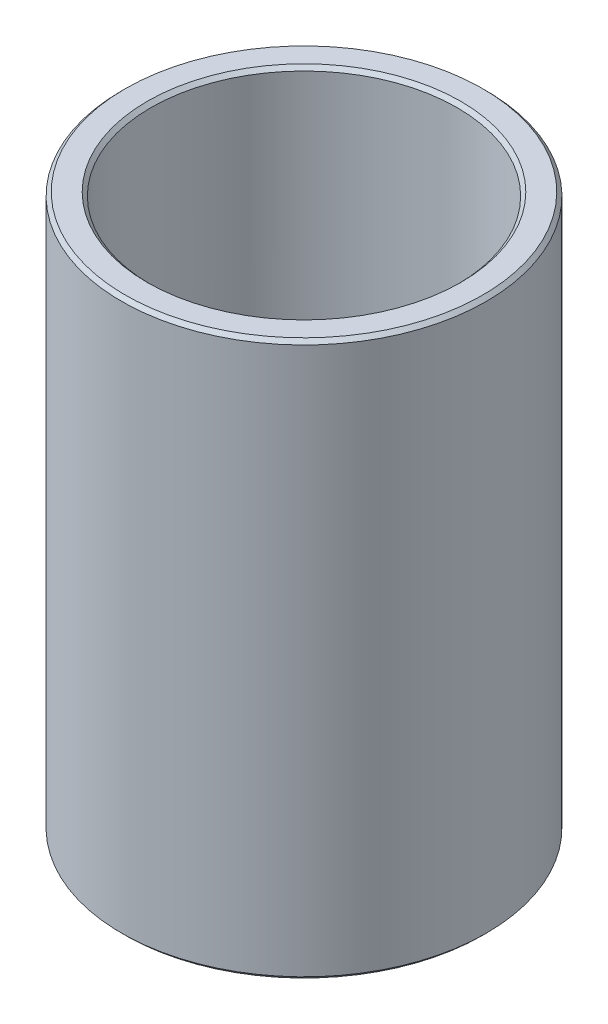
ISO-10303-21;
HEADER;
FILE_DESCRIPTION(('STEP AP214'),'2;1');
FILE_NAME('part.step','',(''),(''),'','','');
FILE_SCHEMA(('AUTOMOTIVE_DESIGN { 1 0 10303 214 1 1 1 1 }'));
ENDSEC;
DATA;
#1=APPLICATION_CONTEXT('core data for automotive mechanical design processes');
#2=APPLICATION_PROTOCOL_DEFINITION('international standard','automotive_design',2000,#1);
#3=PRODUCT_CONTEXT('',#1,'mechanical');
#4=PRODUCT('Part','Part','',(#3));
#5=PRODUCT_RELATED_PRODUCT_CATEGORY('part','',(#4));
#6=PRODUCT_DEFINITION_FORMATION('','',#4);
#7=PRODUCT_DEFINITION_CONTEXT('part definition',#1,'design');
#8=PRODUCT_DEFINITION('design','',#6,#7);
#9=PRODUCT_DEFINITION_SHAPE('','',#8);
#10=(LENGTH_UNIT() NAMED_UNIT(*) SI_UNIT(.MILLI.,.METRE.));
#11=(NAMED_UNIT(*) PLANE_ANGLE_UNIT() SI_UNIT($,.RADIAN.));
#12=(NAMED_UNIT(*) SI_UNIT($,.STERADIAN.) SOLID_ANGLE_UNIT());
#13=UNCERTAINTY_MEASURE_WITH_UNIT(LENGTH_MEASURE(1.E-05),#10,'distance_accuracy_value','');
#14=(GEOMETRIC_REPRESENTATION_CONTEXT(3) GLOBAL_UNCERTAINTY_ASSIGNED_CONTEXT((#13)) GLOBAL_UNIT_ASSIGNED_CONTEXT((#10,
#11,#12)) REPRESENTATION_CONTEXT('',''));
#15=CARTESIAN_POINT('',(0.,0.,0.));
#16=DIRECTION('',(0.,0.,1.));
#17=DIRECTION('',(1.,0.,0.));
#18=AXIS2_PLACEMENT_3D('',#15,#16,#17);
#19=CARTESIAN_POINT('',(12.5,0.,0.));
#20=DIRECTION('',(0.,-1.,0.));
#21=DIRECTION('',(1.,0.,0.));
#22=AXIS2_PLACEMENT_3D('',#19,#20,#21);
#23=PLANE('',#22);
#24=CARTESIAN_POINT('',(0.,0.,0.));
#25=DIRECTION('',(0.,-1.,0.));
#26=DIRECTION('',(1.,0.,0.));
#27=AXIS2_PLACEMENT_3D('',#24,#25,#26);
#28=CIRCLE('',#27,2.25000000000011);
#29=CARTESIAN_POINT('',(2.25000000000011,0.,0.));
#30=VERTEX_POINT('',#29);
#31=EDGE_CURVE('E10',#30,#30,#28,.F.);
#32=ORIENTED_EDGE('',*,*,#31,.T.);
#33=EDGE_LOOP('',(#32));
#34=FACE_BOUND('',#33,.T.);
#35=CARTESIAN_POINT('',(0.,0.,0.));
#36=DIRECTION('',(0.,-1.,0.));
#37=DIRECTION('',(1.,0.,0.));
#38=AXIS2_PLACEMENT_3D('',#35,#36,#37);
#39=CIRCLE('',#38,12.2499999999999);
#40=CARTESIAN_POINT('',(12.2499999999999,0.,0.));
#41=VERTEX_POINT('',#40);
#42=EDGE_CURVE('E42',#41,#41,#39,.T.);
#43=ORIENTED_EDGE('',*,*,#42,.T.);
#44=EDGE_LOOP('',(#43));
#45=FACE_BOUND('',#44,.T.);
#46=ADVANCED_FACE('F34',(#34,#45),#23,.T.);
#47=CARTESIAN_POINT('',(2.0140746375547E-12,-587.151147980489,0.));
#48=DIRECTION('',(0.,-1.,0.));
#49=DIRECTION('',(1.,0.,0.));
#50=AXIS2_PLACEMENT_3D('',#47,#48,#49);
#51=CYLINDRICAL_SURFACE('',#50,2.);
#52=CARTESIAN_POINT('',(0.,0.250000000000083,0.));
#53=DIRECTION('',(0.,-1.,0.));
#54=DIRECTION('',(1.,0.,0.));
#55=AXIS2_PLACEMENT_3D('',#52,#53,#54);
#56=CIRCLE('',#55,2.);
#57=CARTESIAN_POINT('',(2.,0.25000000000009,0.));
#58=VERTEX_POINT('',#57);
#59=EDGE_CURVE('E46',#58,#58,#56,.T.);
#60=ORIENTED_EDGE('',*,*,#59,.T.);
#61=EDGE_LOOP('',(#60));
#62=FACE_BOUND('',#61,.T.);
#63=CARTESIAN_POINT('',(0.,1.,0.));
#64=DIRECTION('',(0.,-1.,0.));
#65=DIRECTION('',(1.,0.,0.));
#66=AXIS2_PLACEMENT_3D('',#63,#64,#65);
#67=CIRCLE('',#66,2.);
#68=CARTESIAN_POINT('',(2.,1.00000000000001,0.));
#69=VERTEX_POINT('',#68);
#70=EDGE_CURVE('E67',#69,#69,#67,.T.);
#71=ORIENTED_EDGE('',*,*,#70,.F.);
#72=EDGE_LOOP('',(#71));
#73=FACE_BOUND('',#72,.T.);
#74=ADVANCED_FACE('F91',(#62,#73),#51,.F.);
#75=CARTESIAN_POINT('',(0.,4.,0.));
#76=DIRECTION('',(0.,1.,0.));
#77=DIRECTION('',(-1.,0.,0.));
#78=AXIS2_PLACEMENT_3D('',#75,#76,#77);
#79=CONICAL_SURFACE('',#78,5.00000000000001,0.78539816339745);
#80=ORIENTED_EDGE('',*,*,#70,.T.);
#81=EDGE_LOOP('',(#80));
#82=FACE_BOUND('',#81,.T.);
#83=CARTESIAN_POINT('',(0.,4.,0.));
#84=DIRECTION('',(0.,-1.,0.));
#85=DIRECTION('',(1.,0.,0.));
#86=AXIS2_PLACEMENT_3D('',#83,#84,#85);
#87=CIRCLE('',#86,5.00000000000001);
#88=CARTESIAN_POINT('',(5.,4.00000000000002,0.));
#89=VERTEX_POINT('',#88);
#90=EDGE_CURVE('E70',#89,#89,#87,.T.);
#91=ORIENTED_EDGE('',*,*,#90,.F.);
#92=EDGE_LOOP('',(#91));
#93=FACE_BOUND('',#92,.T.);
#94=ADVANCED_FACE('F81',(#82,#93),#79,.F.);
#95=CARTESIAN_POINT('',(5.,3.99999999999999,0.));
#96=DIRECTION('',(0.,1.,0.));
#97=DIRECTION('',(-1.,0.,0.));
#98=AXIS2_PLACEMENT_3D('',#95,#96,#97);
#99=PLANE('',#98);
#100=ORIENTED_EDGE('',*,*,#90,.T.);
#101=EDGE_LOOP('',(#100));
#102=FACE_BOUND('',#101,.T.);
#103=CARTESIAN_POINT('',(0.,4.,0.));
#104=DIRECTION('',(0.,-1.,0.));
#105=DIRECTION('',(1.,0.,0.));
#106=AXIS2_PLACEMENT_3D('',#103,#104,#105);
#107=CIRCLE('',#106,10.5);
#108=CARTESIAN_POINT('',(10.5,4.00000000000004,0.));
#109=VERTEX_POINT('',#108);
#110=EDGE_CURVE('E73',#109,#109,#107,.T.);
#111=ORIENTED_EDGE('',*,*,#110,.F.);
#112=EDGE_LOOP('',(#111));
#113=FACE_BOUND('',#112,.T.);
#114=ADVANCED_FACE('F79',(#102,#113),#99,.T.);
#115=CARTESIAN_POINT('',(2.0140746375547E-12,-587.151147980489,0.));
#116=DIRECTION('',(0.,-1.,0.));
#117=DIRECTION('',(1.,0.,0.));
#118=AXIS2_PLACEMENT_3D('',#115,#116,#117);
#119=CYLINDRICAL_SURFACE('',#118,10.5000000000001);
#120=CARTESIAN_POINT('',(-1.29491899707939E-13,37.7500000000001,0.));
#121=DIRECTION('',(0.,1.,0.));
#122=DIRECTION('',(-1.,0.,0.));
#123=AXIS2_PLACEMENT_3D('',#120,#121,#122);
#124=CIRCLE('',#123,10.5000000000001);
#125=CARTESIAN_POINT('',(-10.5000000000002,37.75,0.));
#126=VERTEX_POINT('',#125);
#127=EDGE_CURVE('E50',#126,#126,#124,.T.);
#128=ORIENTED_EDGE('',*,*,#127,.T.);
#129=EDGE_LOOP('',(#128));
#130=FACE_BOUND('',#129,.T.);
#131=ORIENTED_EDGE('',*,*,#110,.T.);
#132=EDGE_LOOP('',(#131));
#133=FACE_BOUND('',#132,.T.);
#134=ADVANCED_FACE('F77',(#130,#133),#119,.F.);
#135=CARTESIAN_POINT('',(10.5,38.,0.));
#136=DIRECTION('',(0.,1.,0.));
#137=DIRECTION('',(-1.,0.,0.));
#138=AXIS2_PLACEMENT_3D('',#135,#136,#137);
#139=PLANE('',#138);
#140=CARTESIAN_POINT('',(-1.3034946195766E-13,38.,0.));
#141=DIRECTION('',(0.,1.,0.));
#142=DIRECTION('',(-1.,0.,0.));
#143=AXIS2_PLACEMENT_3D('',#140,#141,#142);
#144=CIRCLE('',#143,12.2500000000004);
#145=CARTESIAN_POINT('',(-12.2500000000005,37.9999999999999,0.));
#146=VERTEX_POINT('',#145);
#147=EDGE_CURVE('E55',#146,#146,#144,.T.);
#148=ORIENTED_EDGE('',*,*,#147,.T.);
#149=EDGE_LOOP('',(#148));
#150=FACE_BOUND('',#149,.T.);
#151=CARTESIAN_POINT('',(-1.3034946195766E-13,38.,0.));
#152=DIRECTION('',(0.,1.,0.));
#153=DIRECTION('',(-1.,0.,0.));
#154=AXIS2_PLACEMENT_3D('',#151,#152,#153);
#155=CIRCLE('',#154,10.75);
#156=CARTESIAN_POINT('',(-10.7500000000001,37.9999999999999,0.));
#157=VERTEX_POINT('',#156);
#158=EDGE_CURVE('E58',#157,#157,#155,.F.);
#159=ORIENTED_EDGE('',*,*,#158,.T.);
#160=EDGE_LOOP('',(#159));
#161=FACE_BOUND('',#160,.T.);
#162=ADVANCED_FACE('F88',(#150,#161),#139,.T.);
#163=CARTESIAN_POINT('',(2.0140746375547E-12,-587.151147980489,0.));
#164=DIRECTION('',(0.,-1.,0.));
#165=DIRECTION('',(1.,0.,0.));
#166=AXIS2_PLACEMENT_3D('',#163,#164,#165);
#167=CYLINDRICAL_SURFACE('',#166,12.5000000000001);
#168=CARTESIAN_POINT('',(-1.29491899707939E-13,37.7500000000003,0.));
#169=DIRECTION('',(0.,1.,0.));
#170=DIRECTION('',(-1.,0.,0.));
#171=AXIS2_PLACEMENT_3D('',#168,#169,#170);
#172=CIRCLE('',#171,12.5000000000001);
#173=CARTESIAN_POINT('',(-12.5000000000002,37.7500000000002,0.));
#174=VERTEX_POINT('',#173);
#175=EDGE_CURVE('E61',#174,#174,#172,.F.);
#176=ORIENTED_EDGE('',*,*,#175,.T.);
#177=EDGE_LOOP('',(#176));
#178=FACE_BOUND('',#177,.T.);
#179=CARTESIAN_POINT('',(0.,0.250000000000083,0.));
#180=DIRECTION('',(0.,-1.,0.));
#181=DIRECTION('',(1.,0.,0.));
#182=AXIS2_PLACEMENT_3D('',#179,#180,#181);
#183=CIRCLE('',#182,12.5000000000001);
#184=CARTESIAN_POINT('',(12.5000000000001,0.250000000000126,0.));
#185=VERTEX_POINT('',#184);
#186=EDGE_CURVE('E64',#185,#185,#183,.F.);
#187=ORIENTED_EDGE('',*,*,#186,.T.);
#188=EDGE_LOOP('',(#187));
#189=FACE_BOUND('',#188,.T.);
#190=ADVANCED_FACE('F110',(#178,#189),#167,.T.);
#191=CARTESIAN_POINT('',(-1.29491899707939E-13,37.7500000000003,0.));
#192=DIRECTION('',(0.,-1.,0.));
#193=DIRECTION('',(1.,0.,0.));
#194=AXIS2_PLACEMENT_3D('',#191,#192,#193);
#195=CONICAL_SURFACE('',#194,12.5000000000001,0.785398163397462);
#196=ORIENTED_EDGE('',*,*,#147,.F.);
#197=EDGE_LOOP('',(#196));
#198=FACE_BOUND('',#197,.T.);
#199=ORIENTED_EDGE('',*,*,#175,.F.);
#200=EDGE_LOOP('',(#199));
#201=FACE_BOUND('',#200,.T.);
#202=ADVANCED_FACE('F103',(#198,#201),#195,.T.);
#203=CARTESIAN_POINT('',(-1.3034946195766E-13,38.,0.));
#204=DIRECTION('',(0.,1.,0.));
#205=DIRECTION('',(-1.,0.,0.));
#206=AXIS2_PLACEMENT_3D('',#203,#204,#205);
#207=CONICAL_SURFACE('',#206,10.75,0.785398163397438);
#208=ORIENTED_EDGE('',*,*,#127,.F.);
#209=EDGE_LOOP('',(#208));
#210=FACE_BOUND('',#209,.T.);
#211=ORIENTED_EDGE('',*,*,#158,.F.);
#212=EDGE_LOOP('',(#211));
#213=FACE_BOUND('',#212,.T.);
#214=ADVANCED_FACE('F109',(#210,#213),#207,.F.);
#215=CARTESIAN_POINT('',(0.,0.250000000000083,0.));
#216=DIRECTION('',(0.,-1.,0.));
#217=DIRECTION('',(1.,0.,0.));
#218=AXIS2_PLACEMENT_3D('',#215,#216,#217);
#219=CONICAL_SURFACE('',#218,2.,0.785398163397447);
#220=ORIENTED_EDGE('',*,*,#31,.F.);
#221=EDGE_LOOP('',(#220));
#222=FACE_BOUND('',#221,.T.);
#223=ORIENTED_EDGE('',*,*,#59,.F.);
#224=EDGE_LOOP('',(#223));
#225=FACE_BOUND('',#224,.T.);
#226=ADVANCED_FACE('F116',(#222,#225),#219,.F.);
#227=CARTESIAN_POINT('',(0.,0.,0.));
#228=DIRECTION('',(0.,1.,0.));
#229=DIRECTION('',(-1.,0.,0.));
#230=AXIS2_PLACEMENT_3D('',#227,#228,#229);
#231=CONICAL_SURFACE('',#230,12.25,0.785398163397504);
#232=ORIENTED_EDGE('',*,*,#186,.F.);
#233=EDGE_LOOP('',(#232));
#234=FACE_BOUND('',#233,.T.);
#235=ORIENTED_EDGE('',*,*,#42,.F.);
#236=EDGE_LOOP('',(#235));
#237=FACE_BOUND('',#236,.T.);
#238=ADVANCED_FACE('F37',(#234,#237),#231,.T.);
#239=CLOSED_SHELL('',(#46,#74,#94,#114,#134,#162,#190,#202,#214,#226,#238));
#240=MANIFOLD_SOLID_BREP('B2',#239);
#241=ADVANCED_BREP_SHAPE_REPRESENTATION('',(#18,#240),#14);
#242=SHAPE_DEFINITION_REPRESENTATION(#9,#241);
ENDSEC;
END-ISO-10303-21;
